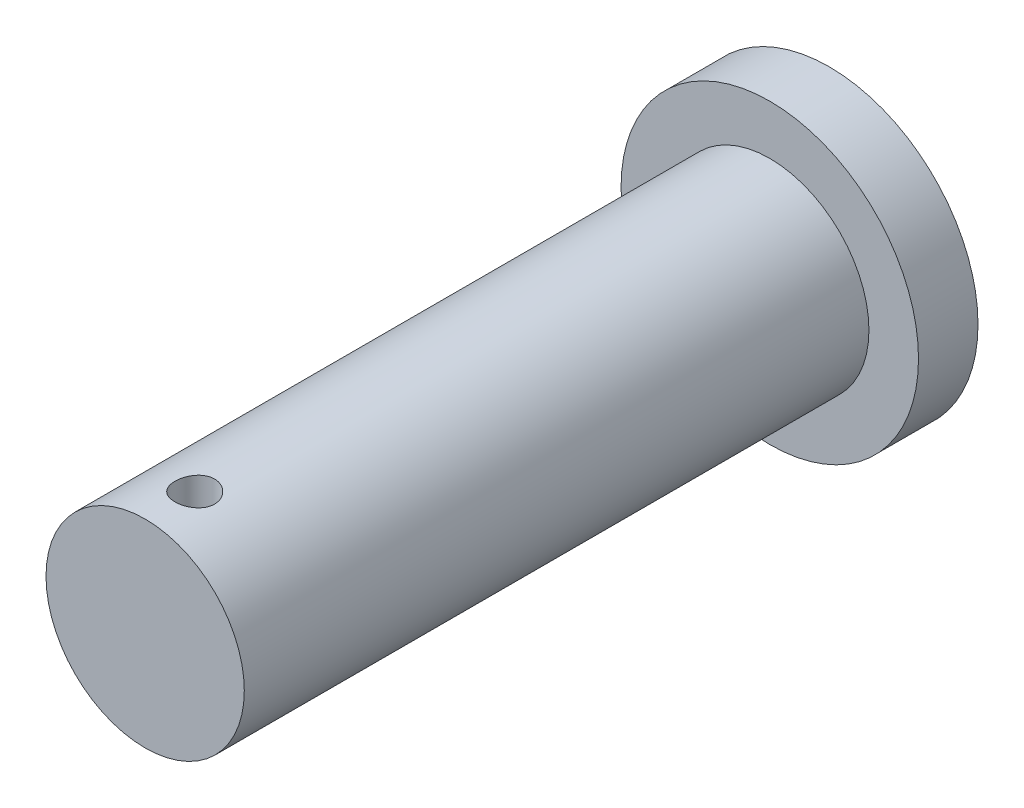
ISO-10303-21;
HEADER;
FILE_DESCRIPTION(('STEP AP214'),'2;1');
FILE_NAME('part.step','',(''),(''),'','','');
FILE_SCHEMA(('AUTOMOTIVE_DESIGN { 1 0 10303 214 1 1 1 1 }'));
ENDSEC;
DATA;
#1=APPLICATION_CONTEXT('core data for automotive mechanical design processes');
#2=APPLICATION_PROTOCOL_DEFINITION('international standard','automotive_design',2000,#1);
#3=PRODUCT_CONTEXT('',#1,'mechanical');
#4=PRODUCT('Part','Part','',(#3));
#5=PRODUCT_RELATED_PRODUCT_CATEGORY('part','',(#4));
#6=PRODUCT_DEFINITION_FORMATION('','',#4);
#7=PRODUCT_DEFINITION_CONTEXT('part definition',#1,'design');
#8=PRODUCT_DEFINITION('design','',#6,#7);
#9=PRODUCT_DEFINITION_SHAPE('','',#8);
#10=(LENGTH_UNIT() NAMED_UNIT(*) SI_UNIT(.MILLI.,.METRE.));
#11=(NAMED_UNIT(*) PLANE_ANGLE_UNIT() SI_UNIT($,.RADIAN.));
#12=(NAMED_UNIT(*) SI_UNIT($,.STERADIAN.) SOLID_ANGLE_UNIT());
#13=UNCERTAINTY_MEASURE_WITH_UNIT(LENGTH_MEASURE(1.E-05),#10,'distance_accuracy_value','');
#14=(GEOMETRIC_REPRESENTATION_CONTEXT(3) GLOBAL_UNCERTAINTY_ASSIGNED_CONTEXT((#13)) GLOBAL_UNIT_ASSIGNED_CONTEXT((#10,
#11,#12)) REPRESENTATION_CONTEXT('',''));
#15=CARTESIAN_POINT('',(0.,0.,0.));
#16=DIRECTION('',(0.,0.,1.));
#17=DIRECTION('',(1.,0.,0.));
#18=AXIS2_PLACEMENT_3D('',#15,#16,#17);
#19=CARTESIAN_POINT('',(0.,0.,31.5));
#20=DIRECTION('',(0.,0.,-1.));
#21=DIRECTION('',(-1.,0.,0.));
#22=AXIS2_PLACEMENT_3D('',#19,#20,#21);
#23=CYLINDRICAL_SURFACE('',#22,5.);
#24=CARTESIAN_POINT('',(0.,-5.,30.));
#25=CARTESIAN_POINT('',(0.0555769067926332,-4.99999897580871,29.9999979555017));
#26=CARTESIAN_POINT('',(0.111179660201522,-4.99906385178231,29.9953511570324));
#27=CARTESIAN_POINT('',(0.220813507689019,-4.99542365623231,29.9769014998848));
#28=CARTESIAN_POINT('',(0.274843317541356,-4.99271717860186,29.9630913671985));
#29=CARTESIAN_POINT('',(0.379730305263313,-4.98583649278287,29.9267587263792));
#30=CARTESIAN_POINT('',(0.430590467933134,-4.98166369076718,29.9042445631553));
#31=CARTESIAN_POINT('',(0.527807988864225,-4.97230398035314,29.8511677524887));
#32=CARTESIAN_POINT('',(0.574165615075812,-4.96711713235707,29.8206055843928));
#33=CARTESIAN_POINT('',(0.661693477314866,-4.9562216532997,29.7518615057086));
#34=CARTESIAN_POINT('',(0.702793951158526,-4.95050745504347,29.7135916446088));
#35=CARTESIAN_POINT('',(0.77803675660803,-4.93924180452588,29.6307075836083));
#36=CARTESIAN_POINT('',(0.812178544770426,-4.93369036500424,29.5860928886649));
#37=CARTESIAN_POINT('',(0.872831753347622,-4.92332441812615,29.4912838069881));
#38=CARTESIAN_POINT('',(0.899270938865869,-4.91851707364946,29.4410423562036));
#39=CARTESIAN_POINT('',(0.94330566658031,-4.91026268058418,29.3367181809959));
#40=CARTESIAN_POINT('',(0.96090208243724,-4.90681549761962,29.2826358366537));
#41=CARTESIAN_POINT('',(0.986525299884829,-4.90172805252204,29.1729156360921));
#42=CARTESIAN_POINT('',(0.994674497958779,-4.90006470107188,29.1173074558578));
#43=CARTESIAN_POINT('',(1.00155212772612,-4.89866375060627,29.0054901786357));
#44=CARTESIAN_POINT('',(1.0002815227135,-4.89892595467841,28.9492811436799));
#45=CARTESIAN_POINT('',(0.988454573101822,-4.90132551148185,28.838753211979));
#46=CARTESIAN_POINT('',(0.978038540243909,-4.90343452858764,28.7844185943727));
#47=CARTESIAN_POINT('',(0.948437884623054,-4.90924546160001,28.678283923337));
#48=CARTESIAN_POINT('',(0.929252843100684,-4.91294745357779,28.626483991081));
#49=CARTESIAN_POINT('',(0.882524783674723,-4.92155618500408,28.5264847382964));
#50=CARTESIAN_POINT('',(0.854926151232117,-4.92647089813704,28.4783121204308));
#51=CARTESIAN_POINT('',(0.792193574572682,-4.93694618773062,28.3872291500272));
#52=CARTESIAN_POINT('',(0.757058764356832,-4.94250683838366,28.3443194031488));
#53=CARTESIAN_POINT('',(0.679499934560588,-4.95377021241462,28.2641705975431));
#54=CARTESIAN_POINT('',(0.636956161212448,-4.95947369210905,28.2270474321409));
#55=CARTESIAN_POINT('',(0.546185024062012,-4.97028848714408,28.1604461536988));
#56=CARTESIAN_POINT('',(0.497957587379391,-4.97539979488974,28.1309681387064));
#57=CARTESIAN_POINT('',(0.397059386878922,-4.98446690160887,28.080472490774));
#58=CARTESIAN_POINT('',(0.344381819585302,-4.98842088848272,28.0594681063555));
#59=CARTESIAN_POINT('',(0.236148976448667,-4.99471408987858,28.0266395259614));
#60=CARTESIAN_POINT('',(0.180594050072452,-4.99705350000531,28.0148142179264));
#61=CARTESIAN_POINT('',(0.0691794056271529,-4.99982671866868,28.0008435462057));
#62=CARTESIAN_POINT('',(0.0133403283255784,-5.0002917465247,27.9985395804597));
#63=CARTESIAN_POINT('',(-0.0979249341927126,-4.99935051930103,28.0032498589422));
#64=CARTESIAN_POINT('',(-0.153351142443792,-4.99794436941446,28.0102635793526));
#65=CARTESIAN_POINT('',(-0.26170565994654,-4.99343832008018,28.033278373544));
#66=CARTESIAN_POINT('',(-0.314651948339901,-4.99035376404206,28.0491980684979));
#67=CARTESIAN_POINT('',(-0.417123627499666,-4.98283552061033,28.0894839826558));
#68=CARTESIAN_POINT('',(-0.466648761637539,-4.97840173214227,28.1138508346768));
#69=CARTESIAN_POINT('',(-0.561541173686217,-4.96859911533294,28.1706824906513));
#70=CARTESIAN_POINT('',(-0.606850126752187,-4.96321950437052,28.2032427810389));
#71=CARTESIAN_POINT('',(-0.691418019119206,-4.95214734829882,28.2754091912073));
#72=CARTESIAN_POINT('',(-0.730676308930762,-4.94645476968388,28.3150160663999));
#73=CARTESIAN_POINT('',(-0.802640590774177,-4.93529303556965,28.4008733518911));
#74=CARTESIAN_POINT('',(-0.835237702448657,-4.92982860233304,28.4472157442213));
#75=CARTESIAN_POINT('',(-0.892185420051208,-4.91984191796194,28.5448113613567));
#76=CARTESIAN_POINT('',(-0.916536355922905,-4.91531962913342,28.5960643895736));
#77=CARTESIAN_POINT('',(-0.956151841581962,-4.90776740584383,28.7017682461496));
#78=CARTESIAN_POINT('',(-0.971463499791053,-4.90472974872187,28.7562008412103));
#79=CARTESIAN_POINT('',(-0.992708651627199,-4.90047436792025,28.8669334534909));
#80=CARTESIAN_POINT('',(-0.998643368225115,-4.89925640691111,28.9232332262093));
#81=CARTESIAN_POINT('',(-1.00092091086747,-4.89879149631379,29.0350088645443));
#82=CARTESIAN_POINT('',(-0.997435788070898,-4.89950919189301,29.090481148927));
#83=CARTESIAN_POINT('',(-0.981352304100063,-4.90275573484614,29.200031649905));
#84=CARTESIAN_POINT('',(-0.968754016129301,-4.90528456767169,29.2541098776948));
#85=CARTESIAN_POINT('',(-0.934878568498957,-4.91185264219158,29.3592277112405));
#86=CARTESIAN_POINT('',(-0.913622506717347,-4.91588821018831,29.4102743605024));
#87=CARTESIAN_POINT('',(-0.863054644601607,-4.9250171497417,29.5081037207344));
#88=CARTESIAN_POINT('',(-0.833742168774886,-4.93011060998894,29.5548860737251));
#89=CARTESIAN_POINT('',(-0.767305914786418,-4.94088960523225,29.6437155721503));
#90=CARTESIAN_POINT('',(-0.730057887235183,-4.94658372909699,29.6856687652676));
#91=CARTESIAN_POINT('',(-0.649064369013142,-4.95786081871955,29.7627862055292));
#92=CARTESIAN_POINT('',(-0.605317387153337,-4.96344375863184,29.7979488903173));
#93=CARTESIAN_POINT('',(-0.512017629088249,-4.97393832387971,29.8608346439465));
#94=CARTESIAN_POINT('',(-0.462408884429836,-4.97884231219246,29.88847600328));
#95=CARTESIAN_POINT('',(-0.359166360940734,-4.98735125085,29.9349861225966));
#96=CARTESIAN_POINT('',(-0.305536260863129,-4.99095737138616,29.9538627895325));
#97=CARTESIAN_POINT('',(-0.209821488923782,-4.99576372595371,29.9786519480447));
#98=CARTESIAN_POINT('',(-0.168281664013787,-4.99734303158452,29.9866431937078));
#99=CARTESIAN_POINT('',(-0.0844995252100679,-4.99946154139893,29.9973179123584));
#100=CARTESIAN_POINT('',(-0.0422572337486194,-5.00000077873155,30.0000015545098));
#101=CARTESIAN_POINT('',(0.,-5.,30.));
#102=B_SPLINE_CURVE_WITH_KNOTS('',3,(#24,#25,#26,#27,#28,#29,#30,#31,#32,#33,#34,#35,#36,#37,
#38,#39,#40,#41,#42,#43,#44,#45,#46,#47,#48,#49,#50,#51,#52,#53,#54,#55,#56,#57,#58,#59,#60,#61,
#62,#63,#64,#65,#66,#67,#68,#69,#70,#71,#72,#73,#74,#75,#76,#77,#78,#79,#80,#81,#82,#83,#84,#85,
#86,#87,#88,#89,#90,#91,#92,#93,#94,#95,#96,#97,#98,#99,#100,#101),.UNSPECIFIED.,.T.,.F.,(4,2,2,
2,2,2,2,2,2,2,2,2,2,2,2,2,2,2,2,2,2,2,2,2,2,2,2,2,2,2,2,2,2,2,2,2,2,2,4),(0.,0.166576130661259,
0.333284650691323,0.499833735250341,0.666372902230865,0.834932670112188,1.00350559674737,
1.17361195005923,1.34370149365198,1.51156185103588,1.67940504281225,1.84471727006278,
2.0100373925373,2.17647490203593,2.34293154749671,2.51238252491351,2.68183567539821,
2.85155274854024,3.02124925698036,3.18810735676266,3.35495607657868,3.52030453950724,
3.68566539216023,3.85305066033359,4.02045388345931,4.19040628579227,4.36035188723468,
4.52940381032724,4.69843368330416,4.86439722567703,5.0303594349261,5.19591961253111,
5.36149367581868,5.52988076239144,5.69830654532932,5.86849496675638,6.0385295551752,
6.16518775289895,6.29184191370998),.UNSPECIFIED.);
#103=CARTESIAN_POINT('',(0.,-5.,30.));
#104=VERTEX_POINT('',#103);
#105=EDGE_CURVE('E10',#104,#104,#102,.T.);
#106=ORIENTED_EDGE('',*,*,#105,.T.);
#107=EDGE_LOOP('',(#106));
#108=FACE_BOUND('',#107,.T.);
#109=CARTESIAN_POINT('',(0.,5.,30.));
#110=CARTESIAN_POINT('',(-0.0555769067926332,4.99999897580871,29.9999979555017));
#111=CARTESIAN_POINT('',(-0.111179660201522,4.99906385178231,29.9953511570324));
#112=CARTESIAN_POINT('',(-0.220813507689019,4.99542365623231,29.9769014998848));
#113=CARTESIAN_POINT('',(-0.274843317541356,4.99271717860186,29.9630913671985));
#114=CARTESIAN_POINT('',(-0.379730305263313,4.98583649278287,29.9267587263792));
#115=CARTESIAN_POINT('',(-0.430590467933134,4.98166369076718,29.9042445631553));
#116=CARTESIAN_POINT('',(-0.527807988864225,4.97230398035314,29.8511677524887));
#117=CARTESIAN_POINT('',(-0.574165615075812,4.96711713235707,29.8206055843928));
#118=CARTESIAN_POINT('',(-0.661693477314866,4.9562216532997,29.7518615057086));
#119=CARTESIAN_POINT('',(-0.702793951158526,4.95050745504347,29.7135916446088));
#120=CARTESIAN_POINT('',(-0.77803675660803,4.93924180452588,29.6307075836083));
#121=CARTESIAN_POINT('',(-0.812178544770426,4.93369036500424,29.5860928886649));
#122=CARTESIAN_POINT('',(-0.872831753347622,4.92332441812615,29.4912838069881));
#123=CARTESIAN_POINT('',(-0.899270938865869,4.91851707364946,29.4410423562036));
#124=CARTESIAN_POINT('',(-0.94330566658031,4.91026268058418,29.3367181809959));
#125=CARTESIAN_POINT('',(-0.96090208243724,4.90681549761962,29.2826358366537));
#126=CARTESIAN_POINT('',(-0.986525299884829,4.90172805252204,29.1729156360921));
#127=CARTESIAN_POINT('',(-0.994674497958779,4.90006470107188,29.1173074558578));
#128=CARTESIAN_POINT('',(-1.00155212772612,4.89866375060627,29.0054901786357));
#129=CARTESIAN_POINT('',(-1.0002815227135,4.89892595467841,28.9492811436799));
#130=CARTESIAN_POINT('',(-0.988454573101822,4.90132551148185,28.838753211979));
#131=CARTESIAN_POINT('',(-0.978038540243909,4.90343452858764,28.7844185943727));
#132=CARTESIAN_POINT('',(-0.948437884623054,4.90924546160001,28.678283923337));
#133=CARTESIAN_POINT('',(-0.929252843100684,4.91294745357779,28.626483991081));
#134=CARTESIAN_POINT('',(-0.882524783674723,4.92155618500408,28.5264847382964));
#135=CARTESIAN_POINT('',(-0.854926151232117,4.92647089813704,28.4783121204308));
#136=CARTESIAN_POINT('',(-0.792193574572682,4.93694618773062,28.3872291500272));
#137=CARTESIAN_POINT('',(-0.757058764356832,4.94250683838366,28.3443194031488));
#138=CARTESIAN_POINT('',(-0.679499934560588,4.95377021241462,28.2641705975431));
#139=CARTESIAN_POINT('',(-0.636956161212448,4.95947369210905,28.2270474321409));
#140=CARTESIAN_POINT('',(-0.546185024062012,4.97028848714408,28.1604461536988));
#141=CARTESIAN_POINT('',(-0.497957587379391,4.97539979488974,28.1309681387064));
#142=CARTESIAN_POINT('',(-0.397059386878922,4.98446690160887,28.080472490774));
#143=CARTESIAN_POINT('',(-0.344381819585302,4.98842088848272,28.0594681063555));
#144=CARTESIAN_POINT('',(-0.236148976448667,4.99471408987858,28.0266395259614));
#145=CARTESIAN_POINT('',(-0.180594050072452,4.99705350000531,28.0148142179264));
#146=CARTESIAN_POINT('',(-0.0691794056271529,4.99982671866868,28.0008435462057));
#147=CARTESIAN_POINT('',(-0.0133403283255784,5.0002917465247,27.9985395804597));
#148=CARTESIAN_POINT('',(0.0979249341927126,4.99935051930103,28.0032498589422));
#149=CARTESIAN_POINT('',(0.153351142443792,4.99794436941446,28.0102635793526));
#150=CARTESIAN_POINT('',(0.26170565994654,4.99343832008018,28.033278373544));
#151=CARTESIAN_POINT('',(0.314651948339901,4.99035376404206,28.0491980684979));
#152=CARTESIAN_POINT('',(0.417123627499666,4.98283552061033,28.0894839826558));
#153=CARTESIAN_POINT('',(0.466648761637539,4.97840173214227,28.1138508346768));
#154=CARTESIAN_POINT('',(0.561541173686217,4.96859911533294,28.1706824906513));
#155=CARTESIAN_POINT('',(0.606850126752187,4.96321950437052,28.2032427810389));
#156=CARTESIAN_POINT('',(0.691418019119206,4.95214734829882,28.2754091912073));
#157=CARTESIAN_POINT('',(0.730676308930762,4.94645476968388,28.3150160663999));
#158=CARTESIAN_POINT('',(0.802640590774177,4.93529303556965,28.4008733518911));
#159=CARTESIAN_POINT('',(0.835237702448657,4.92982860233304,28.4472157442213));
#160=CARTESIAN_POINT('',(0.892185420051208,4.91984191796194,28.5448113613567));
#161=CARTESIAN_POINT('',(0.916536355922905,4.91531962913342,28.5960643895736));
#162=CARTESIAN_POINT('',(0.956151841581962,4.90776740584383,28.7017682461496));
#163=CARTESIAN_POINT('',(0.971463499791053,4.90472974872187,28.7562008412103));
#164=CARTESIAN_POINT('',(0.992708651627199,4.90047436792025,28.8669334534909));
#165=CARTESIAN_POINT('',(0.998643368225115,4.89925640691111,28.9232332262093));
#166=CARTESIAN_POINT('',(1.00092091086747,4.89879149631379,29.0350088645443));
#167=CARTESIAN_POINT('',(0.997435788070898,4.89950919189301,29.090481148927));
#168=CARTESIAN_POINT('',(0.981352304100063,4.90275573484614,29.200031649905));
#169=CARTESIAN_POINT('',(0.968754016129301,4.90528456767169,29.2541098776948));
#170=CARTESIAN_POINT('',(0.934878568498957,4.91185264219158,29.3592277112405));
#171=CARTESIAN_POINT('',(0.913622506717347,4.91588821018831,29.4102743605024));
#172=CARTESIAN_POINT('',(0.863054644601607,4.9250171497417,29.5081037207344));
#173=CARTESIAN_POINT('',(0.833742168774886,4.93011060998894,29.5548860737251));
#174=CARTESIAN_POINT('',(0.767305914786418,4.94088960523225,29.6437155721503));
#175=CARTESIAN_POINT('',(0.730057887235183,4.94658372909699,29.6856687652676));
#176=CARTESIAN_POINT('',(0.649064369013142,4.95786081871955,29.7627862055292));
#177=CARTESIAN_POINT('',(0.605317387153337,4.96344375863184,29.7979488903173));
#178=CARTESIAN_POINT('',(0.512017629088249,4.97393832387971,29.8608346439465));
#179=CARTESIAN_POINT('',(0.462408884429836,4.97884231219246,29.88847600328));
#180=CARTESIAN_POINT('',(0.359166360940734,4.98735125085,29.9349861225966));
#181=CARTESIAN_POINT('',(0.305536260863129,4.99095737138616,29.9538627895325));
#182=CARTESIAN_POINT('',(0.209821488923782,4.99576372595371,29.9786519480447));
#183=CARTESIAN_POINT('',(0.168281664013787,4.99734303158452,29.9866431937078));
#184=CARTESIAN_POINT('',(0.0844995252100679,4.99946154139893,29.9973179123584));
#185=CARTESIAN_POINT('',(0.0422572337486194,5.00000077873155,30.0000015545098));
#186=CARTESIAN_POINT('',(0.,5.,30.));
#187=B_SPLINE_CURVE_WITH_KNOTS('',3,(#109,#110,#111,#112,#113,#114,#115,#116,#117,#118,#119,
#120,#121,#122,#123,#124,#125,#126,#127,#128,#129,#130,#131,#132,#133,#134,#135,#136,#137,#138,
#139,#140,#141,#142,#143,#144,#145,#146,#147,#148,#149,#150,#151,#152,#153,#154,#155,#156,#157,
#158,#159,#160,#161,#162,#163,#164,#165,#166,#167,#168,#169,#170,#171,#172,#173,#174,#175,#176,
#177,#178,#179,#180,#181,#182,#183,#184,#185,#186),.UNSPECIFIED.,.T.,.F.,(4,2,2,2,2,2,2,2,2,2,2,
2,2,2,2,2,2,2,2,2,2,2,2,2,2,2,2,2,2,2,2,2,2,2,2,2,2,2,4),(0.,0.166576130661259,
0.333284650691323,0.499833735250341,0.666372902230865,0.834932670112188,1.00350559674737,
1.17361195005923,1.34370149365198,1.51156185103588,1.67940504281225,1.84471727006278,
2.0100373925373,2.17647490203593,2.34293154749671,2.51238252491351,2.68183567539821,
2.85155274854024,3.02124925698036,3.18810735676266,3.35495607657868,3.52030453950724,
3.68566539216023,3.85305066033359,4.02045388345931,4.19040628579227,4.36035188723468,
4.52940381032724,4.69843368330416,4.86439722567703,5.0303594349261,5.19591961253111,
5.36149367581868,5.52988076239144,5.69830654532932,5.86849496675638,6.0385295551752,
6.16518775289895,6.29184191370998),.UNSPECIFIED.);
#188=CARTESIAN_POINT('',(0.,5.,30.));
#189=VERTEX_POINT('',#188);
#190=EDGE_CURVE('E43',#189,#189,#187,.T.);
#191=ORIENTED_EDGE('',*,*,#190,.T.);
#192=EDGE_LOOP('',(#191));
#193=FACE_BOUND('',#192,.T.);
#194=CARTESIAN_POINT('',(0.,0.,31.5));
#195=DIRECTION('',(0.,0.,1.));
#196=DIRECTION('',(1.,0.,0.));
#197=AXIS2_PLACEMENT_3D('',#194,#195,#196);
#198=CIRCLE('',#197,5.);
#199=CARTESIAN_POINT('',(5.,0.,31.5));
#200=VERTEX_POINT('',#199);
#201=EDGE_CURVE('E47',#200,#200,#198,.T.);
#202=ORIENTED_EDGE('',*,*,#201,.F.);
#203=EDGE_LOOP('',(#202));
#204=FACE_BOUND('',#203,.T.);
#205=CARTESIAN_POINT('',(0.,0.,0.));
#206=DIRECTION('',(0.,0.,1.));
#207=DIRECTION('',(1.,0.,0.));
#208=AXIS2_PLACEMENT_3D('',#205,#206,#207);
#209=CIRCLE('',#208,5.);
#210=CARTESIAN_POINT('',(5.,0.,0.));
#211=VERTEX_POINT('',#210);
#212=EDGE_CURVE('E51',#211,#211,#209,.T.);
#213=ORIENTED_EDGE('',*,*,#212,.T.);
#214=EDGE_LOOP('',(#213));
#215=FACE_BOUND('',#214,.T.);
#216=ADVANCED_FACE('F32',(#108,#193,#204,#215),#23,.T.);
#217=CARTESIAN_POINT('',(0.,0.,31.5));
#218=DIRECTION('',(0.,0.,1.));
#219=DIRECTION('',(1.,0.,0.));
#220=AXIS2_PLACEMENT_3D('',#217,#218,#219);
#221=PLANE('',#220);
#222=ORIENTED_EDGE('',*,*,#201,.T.);
#223=EDGE_LOOP('',(#222));
#224=FACE_BOUND('',#223,.T.);
#225=ADVANCED_FACE('F62',(#224),#221,.T.);
#226=CARTESIAN_POINT('',(0.,-5.,29.));
#227=DIRECTION('',(0.,1.,0.));
#228=DIRECTION('',(0.,0.,1.));
#229=AXIS2_PLACEMENT_3D('',#226,#227,#228);
#230=CYLINDRICAL_SURFACE('',#229,1.);
#231=ORIENTED_EDGE('',*,*,#190,.F.);
#232=EDGE_LOOP('',(#231));
#233=FACE_BOUND('',#232,.T.);
#234=ORIENTED_EDGE('',*,*,#105,.F.);
#235=EDGE_LOOP('',(#234));
#236=FACE_BOUND('',#235,.T.);
#237=ADVANCED_FACE('F57',(#233,#236),#230,.F.);
#238=CARTESIAN_POINT('',(0.,0.,-3.));
#239=DIRECTION('',(0.,0.,1.));
#240=DIRECTION('',(1.,0.,0.));
#241=AXIS2_PLACEMENT_3D('',#238,#239,#240);
#242=CYLINDRICAL_SURFACE('',#241,7.5);
#243=CARTESIAN_POINT('',(0.,0.,-3.));
#244=DIRECTION('',(0.,0.,-1.));
#245=DIRECTION('',(-1.,0.,0.));
#246=AXIS2_PLACEMENT_3D('',#243,#244,#245);
#247=CIRCLE('',#246,7.5);
#248=CARTESIAN_POINT('',(-7.5,0.,-3.));
#249=VERTEX_POINT('',#248);
#250=EDGE_CURVE('E77',#249,#249,#247,.T.);
#251=ORIENTED_EDGE('',*,*,#250,.F.);
#252=EDGE_LOOP('',(#251));
#253=FACE_BOUND('',#252,.T.);
#254=CARTESIAN_POINT('',(0.,0.,0.));
#255=DIRECTION('',(0.,0.,-1.));
#256=DIRECTION('',(-1.,0.,0.));
#257=AXIS2_PLACEMENT_3D('',#254,#255,#256);
#258=CIRCLE('',#257,7.5);
#259=CARTESIAN_POINT('',(-7.5,0.,0.));
#260=VERTEX_POINT('',#259);
#261=EDGE_CURVE('E79',#260,#260,#258,.T.);
#262=ORIENTED_EDGE('',*,*,#261,.T.);
#263=EDGE_LOOP('',(#262));
#264=FACE_BOUND('',#263,.T.);
#265=ADVANCED_FACE('F61',(#253,#264),#242,.T.);
#266=CARTESIAN_POINT('',(0.,0.,-3.));
#267=DIRECTION('',(0.,0.,-1.));
#268=DIRECTION('',(-1.,0.,0.));
#269=AXIS2_PLACEMENT_3D('',#266,#267,#268);
#270=PLANE('',#269);
#271=ORIENTED_EDGE('',*,*,#250,.T.);
#272=EDGE_LOOP('',(#271));
#273=FACE_BOUND('',#272,.T.);
#274=ADVANCED_FACE('F90',(#273),#270,.T.);
#275=CARTESIAN_POINT('',(0.,0.,0.));
#276=DIRECTION('',(0.,0.,-1.));
#277=DIRECTION('',(-1.,0.,0.));
#278=AXIS2_PLACEMENT_3D('',#275,#276,#277);
#279=PLANE('',#278);
#280=ORIENTED_EDGE('',*,*,#212,.F.);
#281=EDGE_LOOP('',(#280));
#282=FACE_BOUND('',#281,.T.);
#283=ORIENTED_EDGE('',*,*,#261,.F.);
#284=EDGE_LOOP('',(#283));
#285=FACE_BOUND('',#284,.T.);
#286=ADVANCED_FACE('F88',(#282,#285),#279,.F.);
#287=CLOSED_SHELL('',(#216,#225,#237,#265,#274,#286));
#288=MANIFOLD_SOLID_BREP('B2',#287);
#289=ADVANCED_BREP_SHAPE_REPRESENTATION('',(#18,#288),#14);
#290=SHAPE_DEFINITION_REPRESENTATION(#9,#289);
ENDSEC;
END-ISO-10303-21;
